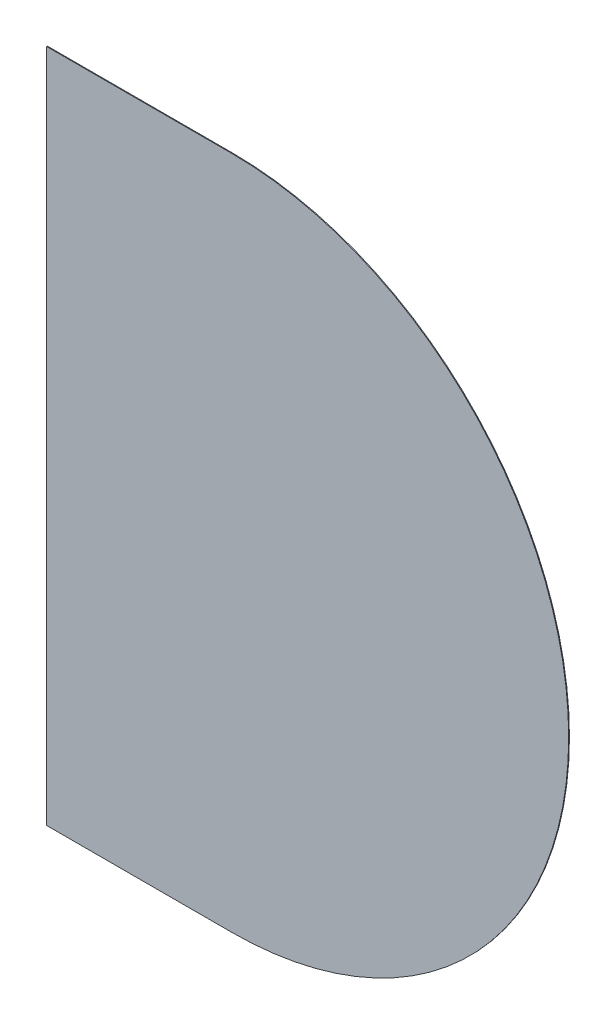
ISO-10303-21;
HEADER;
FILE_DESCRIPTION(('STEP AP214'),'2;1');
FILE_NAME('part.step','',(''),(''),'','','');
FILE_SCHEMA(('AUTOMOTIVE_DESIGN { 1 0 10303 214 1 1 1 1 }'));
ENDSEC;
DATA;
#1=APPLICATION_CONTEXT('core data for automotive mechanical design processes');
#2=APPLICATION_PROTOCOL_DEFINITION('international standard','automotive_design',2000,#1);
#3=PRODUCT_CONTEXT('',#1,'mechanical');
#4=PRODUCT('Part','Part','',(#3));
#5=PRODUCT_RELATED_PRODUCT_CATEGORY('part','',(#4));
#6=PRODUCT_DEFINITION_FORMATION('','',#4);
#7=PRODUCT_DEFINITION_CONTEXT('part definition',#1,'design');
#8=PRODUCT_DEFINITION('design','',#6,#7);
#9=PRODUCT_DEFINITION_SHAPE('','',#8);
#10=(LENGTH_UNIT() NAMED_UNIT(*) SI_UNIT(.MILLI.,.METRE.));
#11=(NAMED_UNIT(*) PLANE_ANGLE_UNIT() SI_UNIT($,.RADIAN.));
#12=(NAMED_UNIT(*) SI_UNIT($,.STERADIAN.) SOLID_ANGLE_UNIT());
#13=UNCERTAINTY_MEASURE_WITH_UNIT(LENGTH_MEASURE(1.E-05),#10,'distance_accuracy_value','');
#14=(GEOMETRIC_REPRESENTATION_CONTEXT(3) GLOBAL_UNCERTAINTY_ASSIGNED_CONTEXT((#13)) GLOBAL_UNIT_ASSIGNED_CONTEXT((#10,
#11,#12)) REPRESENTATION_CONTEXT('',''));
#15=CARTESIAN_POINT('',(0.,0.,0.));
#16=DIRECTION('',(0.,0.,1.));
#17=DIRECTION('',(1.,0.,0.));
#18=AXIS2_PLACEMENT_3D('',#15,#16,#17);
#19=CARTESIAN_POINT('',(0.,0.,2.));
#20=DIRECTION('',(1.,0.,0.));
#21=DIRECTION('',(0.,1.,0.));
#22=AXIS2_PLACEMENT_3D('',#19,#20,#21);
#23=PLANE('',#22);
#24=DIRECTION('',(0.,-1.,0.));
#25=VECTOR('',#24,1.);
#26=CARTESIAN_POINT('',(0.,0.,0.));
#27=LINE('',#26,#25);
#28=CARTESIAN_POINT('',(-3.33066907387547E-13,1770.,0.));
#29=VERTEX_POINT('',#28);
#30=CARTESIAN_POINT('',(0.,0.,0.));
#31=VERTEX_POINT('',#30);
#32=EDGE_CURVE('E107',#29,#31,#27,.T.);
#33=ORIENTED_EDGE('',*,*,#32,.T.);
#34=DIRECTION('',(0.,0.,-1.));
#35=VECTOR('',#34,1.);
#36=CARTESIAN_POINT('',(0.,0.,2.));
#37=LINE('',#36,#35);
#38=CARTESIAN_POINT('',(0.,0.,2.));
#39=VERTEX_POINT('',#38);
#40=EDGE_CURVE('E11',#39,#31,#37,.T.);
#41=ORIENTED_EDGE('',*,*,#40,.F.);
#42=DIRECTION('',(0.,-1.,0.));
#43=VECTOR('',#42,1.);
#44=CARTESIAN_POINT('',(0.,0.,2.));
#45=LINE('',#44,#43);
#46=CARTESIAN_POINT('',(-3.33066907387547E-13,1770.,2.));
#47=VERTEX_POINT('',#46);
#48=EDGE_CURVE('E91',#47,#39,#45,.T.);
#49=ORIENTED_EDGE('',*,*,#48,.F.);
#50=DIRECTION('',(0.,0.,-1.));
#51=VECTOR('',#50,1.);
#52=CARTESIAN_POINT('',(-3.33066907387547E-13,1770.,2.));
#53=LINE('',#52,#51);
#54=EDGE_CURVE('E103',#47,#29,#53,.T.);
#55=ORIENTED_EDGE('',*,*,#54,.T.);
#56=EDGE_LOOP('',(#33,#41,#49,#55));
#57=FACE_BOUND('',#56,.T.);
#58=ADVANCED_FACE('F39',(#57),#23,.F.);
#59=CARTESIAN_POINT('',(0.,0.,2.));
#60=DIRECTION('',(0.,1.,0.));
#61=DIRECTION('',(0.,0.,1.));
#62=AXIS2_PLACEMENT_3D('',#59,#60,#61);
#63=PLANE('',#62);
#64=DIRECTION('',(1.,0.,0.));
#65=VECTOR('',#64,1.);
#66=CARTESIAN_POINT('',(0.,0.,0.));
#67=LINE('',#66,#65);
#68=CARTESIAN_POINT('',(485.,0.,0.));
#69=VERTEX_POINT('',#68);
#70=EDGE_CURVE('E96',#31,#69,#67,.T.);
#71=ORIENTED_EDGE('',*,*,#70,.T.);
#72=DIRECTION('',(0.,0.,-1.));
#73=VECTOR('',#72,1.);
#74=CARTESIAN_POINT('',(485.,0.,2.));
#75=LINE('',#74,#73);
#76=CARTESIAN_POINT('',(485.,0.,2.));
#77=VERTEX_POINT('',#76);
#78=EDGE_CURVE('E48',#77,#69,#75,.T.);
#79=ORIENTED_EDGE('',*,*,#78,.F.);
#80=DIRECTION('',(1.,0.,0.));
#81=VECTOR('',#80,1.);
#82=CARTESIAN_POINT('',(0.,0.,2.));
#83=LINE('',#82,#81);
#84=EDGE_CURVE('E86',#39,#77,#83,.T.);
#85=ORIENTED_EDGE('',*,*,#84,.F.);
#86=ORIENTED_EDGE('',*,*,#40,.T.);
#87=EDGE_LOOP('',(#71,#79,#85,#86));
#88=FACE_BOUND('',#87,.T.);
#89=ADVANCED_FACE('F95',(#88),#63,.F.);
#90=CARTESIAN_POINT('',(485.,885.,2.));
#91=DIRECTION('',(0.,0.,-1.));
#92=DIRECTION('',(-1.,0.,0.));
#93=AXIS2_PLACEMENT_3D('',#90,#91,#92);
#94=CYLINDRICAL_SURFACE('',#93,885.);
#95=CARTESIAN_POINT('',(485.,885.,0.));
#96=DIRECTION('',(0.,0.,1.));
#97=DIRECTION('',(-1.,0.,0.));
#98=AXIS2_PLACEMENT_3D('',#95,#96,#97);
#99=CIRCLE('',#98,885.);
#100=CARTESIAN_POINT('',(485.,1770.,0.));
#101=VERTEX_POINT('',#100);
#102=EDGE_CURVE('E73',#69,#101,#99,.T.);
#103=ORIENTED_EDGE('',*,*,#102,.T.);
#104=DIRECTION('',(0.,0.,-1.));
#105=VECTOR('',#104,1.);
#106=CARTESIAN_POINT('',(485.,1770.,2.));
#107=LINE('',#106,#105);
#108=CARTESIAN_POINT('',(485.,1770.,2.));
#109=VERTEX_POINT('',#108);
#110=EDGE_CURVE('E98',#109,#101,#107,.T.);
#111=ORIENTED_EDGE('',*,*,#110,.F.);
#112=CARTESIAN_POINT('',(485.,885.,2.));
#113=DIRECTION('',(0.,0.,1.));
#114=DIRECTION('',(-1.,0.,0.));
#115=AXIS2_PLACEMENT_3D('',#112,#113,#114);
#116=CIRCLE('',#115,885.);
#117=EDGE_CURVE('E89',#77,#109,#116,.T.);
#118=ORIENTED_EDGE('',*,*,#117,.F.);
#119=ORIENTED_EDGE('',*,*,#78,.T.);
#120=EDGE_LOOP('',(#103,#111,#118,#119));
#121=FACE_BOUND('',#120,.T.);
#122=ADVANCED_FACE('F99',(#121),#94,.T.);
#123=CARTESIAN_POINT('',(-3.33066907387547E-13,1770.,2.));
#124=DIRECTION('',(0.,-1.,0.));
#125=DIRECTION('',(0.,0.,-1.));
#126=AXIS2_PLACEMENT_3D('',#123,#124,#125);
#127=PLANE('',#126);
#128=DIRECTION('',(-1.,0.,0.));
#129=VECTOR('',#128,1.);
#130=CARTESIAN_POINT('',(-3.33066907387547E-13,1770.,0.));
#131=LINE('',#130,#129);
#132=EDGE_CURVE('E79',#101,#29,#131,.T.);
#133=ORIENTED_EDGE('',*,*,#132,.T.);
#134=ORIENTED_EDGE('',*,*,#54,.F.);
#135=DIRECTION('',(-1.,0.,0.));
#136=VECTOR('',#135,1.);
#137=CARTESIAN_POINT('',(-3.33066907387547E-13,1770.,2.));
#138=LINE('',#137,#136);
#139=EDGE_CURVE('E56',#109,#47,#138,.T.);
#140=ORIENTED_EDGE('',*,*,#139,.F.);
#141=ORIENTED_EDGE('',*,*,#110,.T.);
#142=EDGE_LOOP('',(#133,#134,#140,#141));
#143=FACE_BOUND('',#142,.T.);
#144=ADVANCED_FACE('F120',(#143),#127,.F.);
#145=CARTESIAN_POINT('',(485.,885.,2.));
#146=DIRECTION('',(0.,0.,-1.));
#147=DIRECTION('',(-1.,0.,0.));
#148=AXIS2_PLACEMENT_3D('',#145,#146,#147);
#149=PLANE('',#148);
#150=ORIENTED_EDGE('',*,*,#48,.T.);
#151=ORIENTED_EDGE('',*,*,#84,.T.);
#152=ORIENTED_EDGE('',*,*,#117,.T.);
#153=ORIENTED_EDGE('',*,*,#139,.T.);
#154=EDGE_LOOP('',(#150,#151,#152,#153));
#155=FACE_BOUND('',#154,.T.);
#156=ADVANCED_FACE('F87',(#155),#149,.F.);
#157=CARTESIAN_POINT('',(485.,885.,0.));
#158=DIRECTION('',(0.,0.,-1.));
#159=DIRECTION('',(-1.,0.,0.));
#160=AXIS2_PLACEMENT_3D('',#157,#158,#159);
#161=PLANE('',#160);
#162=ORIENTED_EDGE('',*,*,#32,.F.);
#163=ORIENTED_EDGE('',*,*,#132,.F.);
#164=ORIENTED_EDGE('',*,*,#102,.F.);
#165=ORIENTED_EDGE('',*,*,#70,.F.);
#166=EDGE_LOOP('',(#162,#163,#164,#165));
#167=FACE_BOUND('',#166,.T.);
#168=ADVANCED_FACE('F123',(#167),#161,.T.);
#169=CLOSED_SHELL('',(#58,#89,#122,#144,#156,#168));
#170=MANIFOLD_SOLID_BREP('B2',#169);
#171=ADVANCED_BREP_SHAPE_REPRESENTATION('',(#18,#170),#14);
#172=SHAPE_DEFINITION_REPRESENTATION(#9,#171);
ENDSEC;
END-ISO-10303-21;
